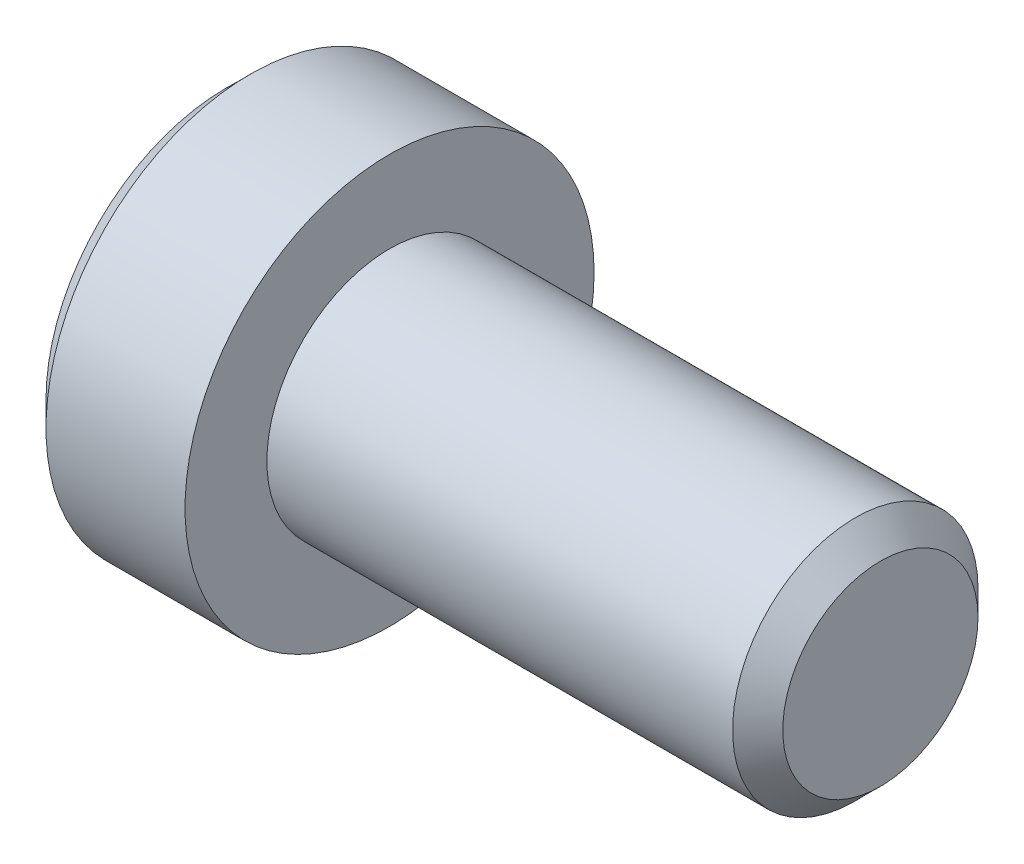
ISO-10303-21;
HEADER;
FILE_DESCRIPTION(('STEP AP214'),'2;1');
FILE_NAME('part.step','',(''),(''),'','','');
FILE_SCHEMA(('AUTOMOTIVE_DESIGN { 1 0 10303 214 1 1 1 1 }'));
ENDSEC;
DATA;
#1=APPLICATION_CONTEXT('core data for automotive mechanical design processes');
#2=APPLICATION_PROTOCOL_DEFINITION('international standard','automotive_design',2000,#1);
#3=PRODUCT_CONTEXT('',#1,'mechanical');
#4=PRODUCT('Part','Part','',(#3));
#5=PRODUCT_RELATED_PRODUCT_CATEGORY('part','',(#4));
#6=PRODUCT_DEFINITION_FORMATION('','',#4);
#7=PRODUCT_DEFINITION_CONTEXT('part definition',#1,'design');
#8=PRODUCT_DEFINITION('design','',#6,#7);
#9=PRODUCT_DEFINITION_SHAPE('','',#8);
#10=(LENGTH_UNIT() NAMED_UNIT(*) SI_UNIT(.MILLI.,.METRE.));
#11=(NAMED_UNIT(*) PLANE_ANGLE_UNIT() SI_UNIT($,.RADIAN.));
#12=(NAMED_UNIT(*) SI_UNIT($,.STERADIAN.) SOLID_ANGLE_UNIT());
#13=UNCERTAINTY_MEASURE_WITH_UNIT(LENGTH_MEASURE(1.E-05),#10,'distance_accuracy_value','');
#14=(GEOMETRIC_REPRESENTATION_CONTEXT(3) GLOBAL_UNCERTAINTY_ASSIGNED_CONTEXT((#13)) GLOBAL_UNIT_ASSIGNED_CONTEXT((#10,
#11,#12)) REPRESENTATION_CONTEXT('',''));
#15=CARTESIAN_POINT('',(0.,0.,0.));
#16=DIRECTION('',(0.,0.,1.));
#17=DIRECTION('',(1.,0.,0.));
#18=AXIS2_PLACEMENT_3D('',#15,#16,#17);
#19=CARTESIAN_POINT('',(-4.,0.,0.));
#20=DIRECTION('',(1.,0.,0.));
#21=DIRECTION('',(0.,0.,-1.));
#22=AXIS2_PLACEMENT_3D('',#19,#20,#21);
#23=PLANE('',#22);
#24=CARTESIAN_POINT('',(-4.,0.,0.));
#25=DIRECTION('',(1.,0.,0.));
#26=DIRECTION('',(0.,0.,-1.));
#27=AXIS2_PLACEMENT_3D('',#24,#25,#26);
#28=CIRCLE('',#27,4.4);
#29=CARTESIAN_POINT('',(-4.,0.,-4.4));
#30=VERTEX_POINT('',#29);
#31=EDGE_CURVE('E115',#30,#30,#28,.T.);
#32=ORIENTED_EDGE('',*,*,#31,.F.);
#33=EDGE_LOOP('',(#32));
#34=FACE_BOUND('',#33,.T.);
#35=DIRECTION('',(0.,0.499999999999983,-0.866025403784448));
#36=VECTOR('',#35,1.);
#37=CARTESIAN_POINT('',(-4.,-2.3094010767585,0.));
#38=LINE('',#37,#36);
#39=CARTESIAN_POINT('',(-4.,-2.3094010767585,0.));
#40=VERTEX_POINT('',#39);
#41=CARTESIAN_POINT('',(-4.,-1.1547005383793,-2.));
#42=VERTEX_POINT('',#41);
#43=EDGE_CURVE('E100',#40,#42,#38,.T.);
#44=ORIENTED_EDGE('',*,*,#43,.T.);
#45=DIRECTION('',(0.,1.,0.));
#46=VECTOR('',#45,1.);
#47=CARTESIAN_POINT('',(-4.,-1.1547005383793,-2.));
#48=LINE('',#47,#46);
#49=CARTESIAN_POINT('',(-4.,1.1547005383793,-2.));
#50=VERTEX_POINT('',#49);
#51=EDGE_CURVE('E88',#42,#50,#48,.T.);
#52=ORIENTED_EDGE('',*,*,#51,.T.);
#53=DIRECTION('',(0.,0.499999999999983,0.866025403784448));
#54=VECTOR('',#53,1.);
#55=CARTESIAN_POINT('',(-4.,1.1547005383793,-2.));
#56=LINE('',#55,#54);
#57=CARTESIAN_POINT('',(-4.,2.3094010767585,0.));
#58=VERTEX_POINT('',#57);
#59=EDGE_CURVE('E99',#50,#58,#56,.T.);
#60=ORIENTED_EDGE('',*,*,#59,.T.);
#61=DIRECTION('',(0.,-0.499999999999983,0.866025403784448));
#62=VECTOR('',#61,1.);
#63=CARTESIAN_POINT('',(-4.,2.3094010767585,0.));
#64=LINE('',#63,#62);
#65=CARTESIAN_POINT('',(-4.,1.1547005383793,2.));
#66=VERTEX_POINT('',#65);
#67=EDGE_CURVE('E125',#58,#66,#64,.T.);
#68=ORIENTED_EDGE('',*,*,#67,.T.);
#69=DIRECTION('',(0.,-1.,0.));
#70=VECTOR('',#69,1.);
#71=CARTESIAN_POINT('',(-4.,1.1547005383793,2.));
#72=LINE('',#71,#70);
#73=CARTESIAN_POINT('',(-4.,-1.1547005383793,2.));
#74=VERTEX_POINT('',#73);
#75=EDGE_CURVE('E130',#66,#74,#72,.T.);
#76=ORIENTED_EDGE('',*,*,#75,.T.);
#77=DIRECTION('',(0.,-0.499999999999983,-0.866025403784448));
#78=VECTOR('',#77,1.);
#79=CARTESIAN_POINT('',(-4.,-1.1547005383793,2.));
#80=LINE('',#79,#78);
#81=EDGE_CURVE('E114',#74,#40,#80,.T.);
#82=ORIENTED_EDGE('',*,*,#81,.T.);
#83=EDGE_LOOP('',(#44,#52,#60,#68,#76,#82));
#84=FACE_BOUND('',#83,.T.);
#85=ADVANCED_FACE('F16',(#34,#84),#23,.F.);
#86=CARTESIAN_POINT('',(-4.,0.,0.));
#87=DIRECTION('',(1.,0.,0.));
#88=DIRECTION('',(0.,0.,-1.));
#89=AXIS2_PLACEMENT_3D('',#86,#87,#88);
#90=CONICAL_SURFACE('',#89,4.4,0.785398163397448);
#91=CARTESIAN_POINT('',(-3.4,0.,0.));
#92=DIRECTION('',(1.,0.,0.));
#93=DIRECTION('',(0.,0.,-1.));
#94=AXIS2_PLACEMENT_3D('',#91,#92,#93);
#95=CIRCLE('',#94,5.);
#96=CARTESIAN_POINT('',(-3.4,0.,-5.));
#97=VERTEX_POINT('',#96);
#98=EDGE_CURVE('E137',#97,#97,#95,.T.);
#99=ORIENTED_EDGE('',*,*,#98,.F.);
#100=EDGE_LOOP('',(#99));
#101=FACE_BOUND('',#100,.T.);
#102=ORIENTED_EDGE('',*,*,#31,.T.);
#103=EDGE_LOOP('',(#102));
#104=FACE_BOUND('',#103,.T.);
#105=ADVANCED_FACE('F279',(#101,#104),#90,.T.);
#106=CARTESIAN_POINT('',(-1.,-2.3094010767585,0.));
#107=DIRECTION('',(0.,0.866025403784449,0.499999999999983));
#108=DIRECTION('',(0.,-0.499999999999983,0.866025403784449));
#109=AXIS2_PLACEMENT_3D('',#106,#107,#108);
#110=PLANE('',#109);
#111=ORIENTED_EDGE('',*,*,#43,.F.);
#112=DIRECTION('',(-1.,0.,0.));
#113=VECTOR('',#112,1.);
#114=CARTESIAN_POINT('',(-1.,-2.3094010767585,0.));
#115=LINE('',#114,#113);
#116=CARTESIAN_POINT('',(-1.,-2.3094010767585,0.));
#117=VERTEX_POINT('',#116);
#118=EDGE_CURVE('E142',#117,#40,#115,.T.);
#119=ORIENTED_EDGE('',*,*,#118,.F.);
#120=DIRECTION('',(0.,0.499999999999983,-0.866025403784448));
#121=VECTOR('',#120,1.);
#122=CARTESIAN_POINT('',(-1.,-2.3094010767585,0.));
#123=LINE('',#122,#121);
#124=CARTESIAN_POINT('',(-1.,-1.73205080756889,-0.999999999999966));
#125=VERTEX_POINT('',#124);
#126=EDGE_CURVE('E144',#117,#125,#123,.T.);
#127=ORIENTED_EDGE('',*,*,#126,.T.);
#128=DIRECTION('',(0.,0.499999999999983,-0.866025403784448));
#129=VECTOR('',#128,1.);
#130=CARTESIAN_POINT('',(-1.,-1.73205080756891,-0.999999999999977));
#131=LINE('',#130,#129);
#132=CARTESIAN_POINT('',(-1.,-1.1547005383793,-2.));
#133=VERTEX_POINT('',#132);
#134=EDGE_CURVE('E109',#125,#133,#131,.T.);
#135=ORIENTED_EDGE('',*,*,#134,.T.);
#136=DIRECTION('',(-1.,0.,0.));
#137=VECTOR('',#136,1.);
#138=CARTESIAN_POINT('',(-1.,-1.1547005383793,-2.));
#139=LINE('',#138,#137);
#140=EDGE_CURVE('E92',#133,#42,#139,.T.);
#141=ORIENTED_EDGE('',*,*,#140,.T.);
#142=EDGE_LOOP('',(#111,#119,#127,#135,#141));
#143=FACE_BOUND('',#142,.T.);
#144=ADVANCED_FACE('F105',(#143),#110,.T.);
#145=CARTESIAN_POINT('',(-1.,-1.1547005383793,-2.));
#146=DIRECTION('',(0.,0.,1.));
#147=DIRECTION('',(1.,0.,0.));
#148=AXIS2_PLACEMENT_3D('',#145,#146,#147);
#149=PLANE('',#148);
#150=ORIENTED_EDGE('',*,*,#51,.F.);
#151=ORIENTED_EDGE('',*,*,#140,.F.);
#152=DIRECTION('',(0.,1.,0.));
#153=VECTOR('',#152,1.);
#154=CARTESIAN_POINT('',(-1.,-1.1547005383793,-2.));
#155=LINE('',#154,#153);
#156=CARTESIAN_POINT('',(-1.,0.,-2.));
#157=VERTEX_POINT('',#156);
#158=EDGE_CURVE('E110',#133,#157,#155,.T.);
#159=ORIENTED_EDGE('',*,*,#158,.T.);
#160=DIRECTION('',(0.,1.,0.));
#161=VECTOR('',#160,1.);
#162=CARTESIAN_POINT('',(-1.,0.,-2.));
#163=LINE('',#162,#161);
#164=CARTESIAN_POINT('',(-1.,1.1547005383793,-2.));
#165=VERTEX_POINT('',#164);
#166=EDGE_CURVE('E156',#157,#165,#163,.T.);
#167=ORIENTED_EDGE('',*,*,#166,.T.);
#168=DIRECTION('',(-1.,0.,0.));
#169=VECTOR('',#168,1.);
#170=CARTESIAN_POINT('',(-1.,1.1547005383793,-2.));
#171=LINE('',#170,#169);
#172=EDGE_CURVE('E95',#165,#50,#171,.T.);
#173=ORIENTED_EDGE('',*,*,#172,.T.);
#174=EDGE_LOOP('',(#150,#151,#159,#167,#173));
#175=FACE_BOUND('',#174,.T.);
#176=ADVANCED_FACE('F90',(#175),#149,.T.);
#177=CARTESIAN_POINT('',(-1.,1.1547005383793,-2.));
#178=DIRECTION('',(0.,-0.866025403784449,0.499999999999983));
#179=DIRECTION('',(0.,-0.499999999999983,-0.866025403784449));
#180=AXIS2_PLACEMENT_3D('',#177,#178,#179);
#181=PLANE('',#180);
#182=ORIENTED_EDGE('',*,*,#59,.F.);
#183=ORIENTED_EDGE('',*,*,#172,.F.);
#184=DIRECTION('',(0.,0.499999999999983,0.866025403784448));
#185=VECTOR('',#184,1.);
#186=CARTESIAN_POINT('',(-1.,1.1547005383793,-2.));
#187=LINE('',#186,#185);
#188=CARTESIAN_POINT('',(-1.,1.73205080756891,-0.999999999999976));
#189=VERTEX_POINT('',#188);
#190=EDGE_CURVE('E163',#165,#189,#187,.T.);
#191=ORIENTED_EDGE('',*,*,#190,.T.);
#192=DIRECTION('',(0.,0.499999999999983,0.866025403784448));
#193=VECTOR('',#192,1.);
#194=CARTESIAN_POINT('',(-1.,1.73205080756891,-0.999999999999975));
#195=LINE('',#194,#193);
#196=CARTESIAN_POINT('',(-1.,2.3094010767585,0.));
#197=VERTEX_POINT('',#196);
#198=EDGE_CURVE('E168',#189,#197,#195,.T.);
#199=ORIENTED_EDGE('',*,*,#198,.T.);
#200=DIRECTION('',(-1.,0.,0.));
#201=VECTOR('',#200,1.);
#202=CARTESIAN_POINT('',(-1.,2.3094010767585,0.));
#203=LINE('',#202,#201);
#204=EDGE_CURVE('E173',#197,#58,#203,.T.);
#205=ORIENTED_EDGE('',*,*,#204,.T.);
#206=EDGE_LOOP('',(#182,#183,#191,#199,#205));
#207=FACE_BOUND('',#206,.T.);
#208=ADVANCED_FACE('F295',(#207),#181,.T.);
#209=CARTESIAN_POINT('',(-1.,2.3094010767585,0.));
#210=DIRECTION('',(0.,-0.866025403784449,-0.499999999999983));
#211=DIRECTION('',(0.,0.499999999999983,-0.866025403784449));
#212=AXIS2_PLACEMENT_3D('',#209,#210,#211);
#213=PLANE('',#212);
#214=ORIENTED_EDGE('',*,*,#67,.F.);
#215=ORIENTED_EDGE('',*,*,#204,.F.);
#216=DIRECTION('',(0.,-0.499999999999983,0.866025403784448));
#217=VECTOR('',#216,1.);
#218=CARTESIAN_POINT('',(-1.,2.3094010767585,0.));
#219=LINE('',#218,#217);
#220=CARTESIAN_POINT('',(-1.,1.73205080756891,0.999999999999976));
#221=VERTEX_POINT('',#220);
#222=EDGE_CURVE('E178',#197,#221,#219,.T.);
#223=ORIENTED_EDGE('',*,*,#222,.T.);
#224=DIRECTION('',(0.,-0.499999999999983,0.866025403784448));
#225=VECTOR('',#224,1.);
#226=CARTESIAN_POINT('',(-1.,1.73205080756891,0.999999999999976));
#227=LINE('',#226,#225);
#228=CARTESIAN_POINT('',(-1.,1.1547005383793,2.));
#229=VERTEX_POINT('',#228);
#230=EDGE_CURVE('E183',#221,#229,#227,.T.);
#231=ORIENTED_EDGE('',*,*,#230,.T.);
#232=DIRECTION('',(-1.,0.,0.));
#233=VECTOR('',#232,1.);
#234=CARTESIAN_POINT('',(-1.,1.1547005383793,2.));
#235=LINE('',#234,#233);
#236=EDGE_CURVE('E188',#229,#66,#235,.T.);
#237=ORIENTED_EDGE('',*,*,#236,.T.);
#238=EDGE_LOOP('',(#214,#215,#223,#231,#237));
#239=FACE_BOUND('',#238,.T.);
#240=ADVANCED_FACE('F298',(#239),#213,.T.);
#241=CARTESIAN_POINT('',(-1.,1.1547005383793,2.));
#242=DIRECTION('',(0.,0.,-1.));
#243=DIRECTION('',(-1.,0.,0.));
#244=AXIS2_PLACEMENT_3D('',#241,#242,#243);
#245=PLANE('',#244);
#246=ORIENTED_EDGE('',*,*,#75,.F.);
#247=ORIENTED_EDGE('',*,*,#236,.F.);
#248=DIRECTION('',(0.,-1.,0.));
#249=VECTOR('',#248,1.);
#250=CARTESIAN_POINT('',(-1.,1.1547005383793,2.));
#251=LINE('',#250,#249);
#252=CARTESIAN_POINT('',(-1.,0.,2.));
#253=VERTEX_POINT('',#252);
#254=EDGE_CURVE('E193',#229,#253,#251,.T.);
#255=ORIENTED_EDGE('',*,*,#254,.T.);
#256=DIRECTION('',(0.,-1.,0.));
#257=VECTOR('',#256,1.);
#258=CARTESIAN_POINT('',(-1.,0.,2.));
#259=LINE('',#258,#257);
#260=CARTESIAN_POINT('',(-1.,-1.1547005383793,2.));
#261=VERTEX_POINT('',#260);
#262=EDGE_CURVE('E198',#253,#261,#259,.T.);
#263=ORIENTED_EDGE('',*,*,#262,.T.);
#264=DIRECTION('',(-1.,0.,0.));
#265=VECTOR('',#264,1.);
#266=CARTESIAN_POINT('',(-1.,-1.1547005383793,2.));
#267=LINE('',#266,#265);
#268=EDGE_CURVE('E203',#261,#74,#267,.T.);
#269=ORIENTED_EDGE('',*,*,#268,.T.);
#270=EDGE_LOOP('',(#246,#247,#255,#263,#269));
#271=FACE_BOUND('',#270,.T.);
#272=ADVANCED_FACE('F302',(#271),#245,.T.);
#273=CARTESIAN_POINT('',(-1.,-1.1547005383793,2.));
#274=DIRECTION('',(0.,0.866025403784449,-0.499999999999983));
#275=DIRECTION('',(0.,0.499999999999983,0.866025403784449));
#276=AXIS2_PLACEMENT_3D('',#273,#274,#275);
#277=PLANE('',#276);
#278=ORIENTED_EDGE('',*,*,#81,.F.);
#279=ORIENTED_EDGE('',*,*,#268,.F.);
#280=DIRECTION('',(0.,-0.499999999999983,-0.866025403784448));
#281=VECTOR('',#280,1.);
#282=CARTESIAN_POINT('',(-1.,-1.1547005383793,2.));
#283=LINE('',#282,#281);
#284=CARTESIAN_POINT('',(-1.,-1.73205080756891,0.999999999999976));
#285=VERTEX_POINT('',#284);
#286=EDGE_CURVE('E208',#261,#285,#283,.T.);
#287=ORIENTED_EDGE('',*,*,#286,.T.);
#288=DIRECTION('',(0.,-0.499999999999983,-0.866025403784448));
#289=VECTOR('',#288,1.);
#290=CARTESIAN_POINT('',(-1.,-1.73205080756891,0.999999999999975));
#291=LINE('',#290,#289);
#292=EDGE_CURVE('E213',#285,#117,#291,.T.);
#293=ORIENTED_EDGE('',*,*,#292,.T.);
#294=ORIENTED_EDGE('',*,*,#118,.T.);
#295=EDGE_LOOP('',(#278,#279,#287,#293,#294));
#296=FACE_BOUND('',#295,.T.);
#297=ADVANCED_FACE('F275',(#296),#277,.T.);
#298=CARTESIAN_POINT('',(12.,0.,0.));
#299=DIRECTION('',(1.,0.,0.));
#300=DIRECTION('',(0.,0.,-1.));
#301=AXIS2_PLACEMENT_3D('',#298,#299,#300);
#302=CYLINDRICAL_SURFACE('',#301,5.);
#303=CARTESIAN_POINT('',(0.,0.,0.));
#304=DIRECTION('',(1.,0.,0.));
#305=DIRECTION('',(0.,0.,-1.));
#306=AXIS2_PLACEMENT_3D('',#303,#304,#305);
#307=CIRCLE('',#306,5.);
#308=CARTESIAN_POINT('',(0.,0.,-5.));
#309=VERTEX_POINT('',#308);
#310=EDGE_CURVE('E218',#309,#309,#307,.T.);
#311=ORIENTED_EDGE('',*,*,#310,.F.);
#312=EDGE_LOOP('',(#311));
#313=FACE_BOUND('',#312,.T.);
#314=ORIENTED_EDGE('',*,*,#98,.T.);
#315=EDGE_LOOP('',(#314));
#316=FACE_BOUND('',#315,.T.);
#317=ADVANCED_FACE('F271',(#313,#316),#302,.T.);
#318=CARTESIAN_POINT('',(-1.,0.,0.));
#319=DIRECTION('',(1.,0.,0.));
#320=DIRECTION('',(0.,0.,-1.));
#321=AXIS2_PLACEMENT_3D('',#318,#319,#320);
#322=PLANE('',#321);
#323=CARTESIAN_POINT('',(-1.,0.,0.));
#324=DIRECTION('',(1.,0.,0.));
#325=DIRECTION('',(0.,-0.866025403784449,0.499999999999983));
#326=AXIS2_PLACEMENT_3D('',#323,#324,#325);
#327=CIRCLE('',#326,2.);
#328=EDGE_CURVE('E34',#285,#125,#327,.T.);
#329=ORIENTED_EDGE('',*,*,#328,.T.);
#330=ORIENTED_EDGE('',*,*,#126,.F.);
#331=ORIENTED_EDGE('',*,*,#292,.F.);
#332=EDGE_LOOP('',(#329,#330,#331));
#333=FACE_BOUND('',#332,.T.);
#334=ADVANCED_FACE('F274',(#333),#322,.F.);
#335=CARTESIAN_POINT('',(-1.,0.,0.));
#336=DIRECTION('',(1.,0.,0.));
#337=DIRECTION('',(0.,-0.866025403784448,-0.499999999999983));
#338=AXIS2_PLACEMENT_3D('',#335,#336,#337);
#339=CIRCLE('',#338,2.);
#340=EDGE_CURVE('E224',#125,#157,#339,.T.);
#341=ORIENTED_EDGE('',*,*,#340,.T.);
#342=ORIENTED_EDGE('',*,*,#158,.F.);
#343=ORIENTED_EDGE('',*,*,#134,.F.);
#344=EDGE_LOOP('',(#341,#342,#343));
#345=FACE_BOUND('',#344,.T.);
#346=ADVANCED_FACE('F311',(#345),#322,.F.);
#347=CARTESIAN_POINT('',(-1.,0.,0.));
#348=DIRECTION('',(1.,0.,0.));
#349=DIRECTION('',(0.,0.,-1.));
#350=AXIS2_PLACEMENT_3D('',#347,#348,#349);
#351=CIRCLE('',#350,2.);
#352=EDGE_CURVE('E229',#157,#189,#351,.T.);
#353=ORIENTED_EDGE('',*,*,#352,.T.);
#354=ORIENTED_EDGE('',*,*,#190,.F.);
#355=ORIENTED_EDGE('',*,*,#166,.F.);
#356=EDGE_LOOP('',(#353,#354,#355));
#357=FACE_BOUND('',#356,.T.);
#358=ADVANCED_FACE('F379',(#357),#322,.F.);
#359=CARTESIAN_POINT('',(-1.,0.,0.));
#360=DIRECTION('',(1.,0.,0.));
#361=DIRECTION('',(0.,0.866025403784448,-0.499999999999983));
#362=AXIS2_PLACEMENT_3D('',#359,#360,#361);
#363=CIRCLE('',#362,2.);
#364=EDGE_CURVE('E234',#189,#221,#363,.T.);
#365=ORIENTED_EDGE('',*,*,#364,.T.);
#366=ORIENTED_EDGE('',*,*,#222,.F.);
#367=ORIENTED_EDGE('',*,*,#198,.F.);
#368=EDGE_LOOP('',(#365,#366,#367));
#369=FACE_BOUND('',#368,.T.);
#370=ADVANCED_FACE('F370',(#369),#322,.F.);
#371=CARTESIAN_POINT('',(-1.,0.,0.));
#372=DIRECTION('',(1.,0.,0.));
#373=DIRECTION('',(0.,0.866025403784449,0.499999999999983));
#374=AXIS2_PLACEMENT_3D('',#371,#372,#373);
#375=CIRCLE('',#374,2.);
#376=EDGE_CURVE('E239',#221,#253,#375,.T.);
#377=ORIENTED_EDGE('',*,*,#376,.T.);
#378=ORIENTED_EDGE('',*,*,#254,.F.);
#379=ORIENTED_EDGE('',*,*,#230,.F.);
#380=EDGE_LOOP('',(#377,#378,#379));
#381=FACE_BOUND('',#380,.T.);
#382=ADVANCED_FACE('F361',(#381),#322,.F.);
#383=CARTESIAN_POINT('',(-1.,0.,0.));
#384=DIRECTION('',(1.,0.,0.));
#385=DIRECTION('',(0.,0.,1.));
#386=AXIS2_PLACEMENT_3D('',#383,#384,#385);
#387=CIRCLE('',#386,2.);
#388=EDGE_CURVE('E244',#253,#285,#387,.T.);
#389=ORIENTED_EDGE('',*,*,#388,.T.);
#390=ORIENTED_EDGE('',*,*,#286,.F.);
#391=ORIENTED_EDGE('',*,*,#262,.F.);
#392=EDGE_LOOP('',(#389,#390,#391));
#393=FACE_BOUND('',#392,.T.);
#394=ADVANCED_FACE('F267',(#393),#322,.F.);
#395=CARTESIAN_POINT('',(0.,5.,0.));
#396=DIRECTION('',(-1.,0.,0.));
#397=DIRECTION('',(0.,0.,1.));
#398=AXIS2_PLACEMENT_3D('',#395,#396,#397);
#399=PLANE('',#398);
#400=CARTESIAN_POINT('',(0.,0.,0.));
#401=DIRECTION('',(1.,0.,0.));
#402=DIRECTION('',(0.,0.,-1.));
#403=AXIS2_PLACEMENT_3D('',#400,#401,#402);
#404=CIRCLE('',#403,3.);
#405=CARTESIAN_POINT('',(0.,0.,-3.));
#406=VERTEX_POINT('',#405);
#407=EDGE_CURVE('E248',#406,#406,#404,.T.);
#408=ORIENTED_EDGE('',*,*,#407,.F.);
#409=EDGE_LOOP('',(#408));
#410=FACE_BOUND('',#409,.T.);
#411=ORIENTED_EDGE('',*,*,#310,.T.);
#412=EDGE_LOOP('',(#411));
#413=FACE_BOUND('',#412,.T.);
#414=ADVANCED_FACE('F264',(#410,#413),#399,.F.);
#415=CARTESIAN_POINT('',(-1.,0.,0.));
#416=DIRECTION('',(-1.,0.,0.));
#417=DIRECTION('',(0.,0.,1.));
#418=AXIS2_PLACEMENT_3D('',#415,#416,#417);
#419=CONICAL_SURFACE('',#418,2.,1.0471975511966);
#420=CARTESIAN_POINT('',(0.15470053837925,0.,0.));
#421=VERTEX_POINT('',#420);
#422=VERTEX_LOOP('',#421);
#423=FACE_BOUND('',#422,.T.);
#424=ORIENTED_EDGE('',*,*,#352,.F.);
#425=ORIENTED_EDGE('',*,*,#340,.F.);
#426=ORIENTED_EDGE('',*,*,#328,.F.);
#427=ORIENTED_EDGE('',*,*,#388,.F.);
#428=ORIENTED_EDGE('',*,*,#376,.F.);
#429=ORIENTED_EDGE('',*,*,#364,.F.);
#430=EDGE_LOOP('',(#424,#425,#426,#427,#428,#429));
#431=FACE_BOUND('',#430,.T.);
#432=ADVANCED_FACE('F260',(#423,#431),#419,.F.);
#433=CARTESIAN_POINT('',(12.,0.,0.));
#434=DIRECTION('',(1.,0.,0.));
#435=DIRECTION('',(0.,0.,-1.));
#436=AXIS2_PLACEMENT_3D('',#433,#434,#435);
#437=CYLINDRICAL_SURFACE('',#436,3.);
#438=CARTESIAN_POINT('',(11.3865,0.,0.));
#439=DIRECTION('',(1.,0.,0.));
#440=DIRECTION('',(0.,0.,-1.));
#441=AXIS2_PLACEMENT_3D('',#438,#439,#440);
#442=CIRCLE('',#441,3.);
#443=CARTESIAN_POINT('',(11.3865,0.,-3.));
#444=VERTEX_POINT('',#443);
#445=EDGE_CURVE('E24',#444,#444,#442,.T.);
#446=ORIENTED_EDGE('',*,*,#445,.F.);
#447=EDGE_LOOP('',(#446));
#448=FACE_BOUND('',#447,.T.);
#449=ORIENTED_EDGE('',*,*,#407,.T.);
#450=EDGE_LOOP('',(#449));
#451=FACE_BOUND('',#450,.T.);
#452=ADVANCED_FACE('F257',(#448,#451),#437,.T.);
#453=CARTESIAN_POINT('',(11.3865,0.,0.));
#454=DIRECTION('',(-1.,0.,0.));
#455=DIRECTION('',(0.,0.,1.));
#456=AXIS2_PLACEMENT_3D('',#453,#454,#455);
#457=CONICAL_SURFACE('',#456,3.,0.785398163397449);
#458=CARTESIAN_POINT('',(12.,0.,0.));
#459=DIRECTION('',(1.,0.,0.));
#460=DIRECTION('',(0.,0.,-1.));
#461=AXIS2_PLACEMENT_3D('',#458,#459,#460);
#462=CIRCLE('',#461,2.3865);
#463=CARTESIAN_POINT('',(12.,0.,-2.3865));
#464=VERTEX_POINT('',#463);
#465=EDGE_CURVE('E11',#464,#464,#462,.T.);
#466=ORIENTED_EDGE('',*,*,#465,.F.);
#467=EDGE_LOOP('',(#466));
#468=FACE_BOUND('',#467,.T.);
#469=ORIENTED_EDGE('',*,*,#445,.T.);
#470=EDGE_LOOP('',(#469));
#471=FACE_BOUND('',#470,.T.);
#472=ADVANCED_FACE('F255',(#468,#471),#457,.T.);
#473=CARTESIAN_POINT('',(12.,2.3865,0.));
#474=DIRECTION('',(-1.,0.,0.));
#475=DIRECTION('',(0.,0.,1.));
#476=AXIS2_PLACEMENT_3D('',#473,#474,#475);
#477=PLANE('',#476);
#478=ORIENTED_EDGE('',*,*,#465,.T.);
#479=EDGE_LOOP('',(#478));
#480=FACE_BOUND('',#479,.T.);
#481=ADVANCED_FACE('F18',(#480),#477,.F.);
#482=CLOSED_SHELL('',(#85,#105,#144,#176,#208,#240,#272,#297,#317,#334,#346,#358,#370,#382,#394,
#414,#432,#452,#472,#481));
#483=MANIFOLD_SOLID_BREP('B1',#482);
#484=ADVANCED_BREP_SHAPE_REPRESENTATION('',(#18,#483),#14);
#485=SHAPE_DEFINITION_REPRESENTATION(#9,#484);
ENDSEC;
END-ISO-10303-21;
